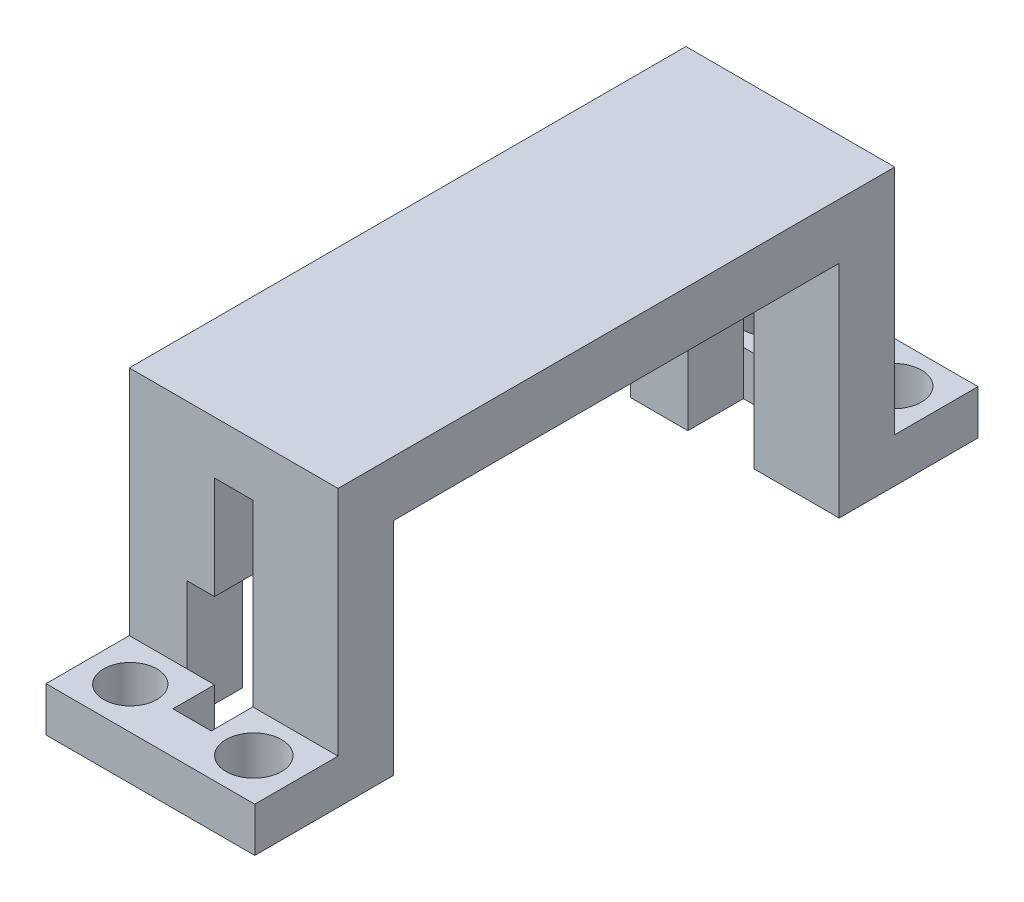
ISO-10303-21;
HEADER;
FILE_DESCRIPTION(('STEP AP214'),'2;1');
FILE_NAME('part.step','',(''),(''),'','','');
FILE_SCHEMA(('AUTOMOTIVE_DESIGN { 1 0 10303 214 1 1 1 1 }'));
ENDSEC;
DATA;
#1=APPLICATION_CONTEXT('core data for automotive mechanical design processes');
#2=APPLICATION_PROTOCOL_DEFINITION('international standard','automotive_design',2000,#1);
#3=PRODUCT_CONTEXT('',#1,'mechanical');
#4=PRODUCT('Part','Part','',(#3));
#5=PRODUCT_RELATED_PRODUCT_CATEGORY('part','',(#4));
#6=PRODUCT_DEFINITION_FORMATION('','',#4);
#7=PRODUCT_DEFINITION_CONTEXT('part definition',#1,'design');
#8=PRODUCT_DEFINITION('design','',#6,#7);
#9=PRODUCT_DEFINITION_SHAPE('','',#8);
#10=(LENGTH_UNIT() NAMED_UNIT(*) SI_UNIT(.MILLI.,.METRE.));
#11=(NAMED_UNIT(*) PLANE_ANGLE_UNIT() SI_UNIT($,.RADIAN.));
#12=(NAMED_UNIT(*) SI_UNIT($,.STERADIAN.) SOLID_ANGLE_UNIT());
#13=UNCERTAINTY_MEASURE_WITH_UNIT(LENGTH_MEASURE(1.E-05),#10,'distance_accuracy_value','');
#14=(GEOMETRIC_REPRESENTATION_CONTEXT(3) GLOBAL_UNCERTAINTY_ASSIGNED_CONTEXT((#13)) GLOBAL_UNIT_ASSIGNED_CONTEXT((#10,
#11,#12)) REPRESENTATION_CONTEXT('',''));
#15=CARTESIAN_POINT('',(0.,0.,0.));
#16=DIRECTION('',(0.,0.,1.));
#17=DIRECTION('',(1.,0.,0.));
#18=AXIS2_PLACEMENT_3D('',#15,#16,#17);
#19=CARTESIAN_POINT('',(7.675,-24.875,-32.5625));
#20=DIRECTION('',(-1.,0.,0.));
#21=DIRECTION('',(0.,0.,1.));
#22=AXIS2_PLACEMENT_3D('',#19,#20,#21);
#23=PLANE('',#22);
#24=DIRECTION('',(0.,0.,-1.));
#25=VECTOR('',#24,1.);
#26=CARTESIAN_POINT('',(7.675,-14.,-20.0625));
#27=LINE('',#26,#25);
#28=CARTESIAN_POINT('',(7.675,-14.,-20.0625));
#29=VERTEX_POINT('',#28);
#30=CARTESIAN_POINT('',(7.675,-14.,-25.0625));
#31=VERTEX_POINT('',#30);
#32=EDGE_CURVE('E270',#29,#31,#27,.T.);
#33=ORIENTED_EDGE('',*,*,#32,.T.);
#34=DIRECTION('',(0.,-1.,0.));
#35=VECTOR('',#34,1.);
#36=CARTESIAN_POINT('',(7.675,-20.875,-25.0625));
#37=LINE('',#36,#35);
#38=CARTESIAN_POINT('',(7.675,-4.75000000000001,-25.0625));
#39=VERTEX_POINT('',#38);
#40=EDGE_CURVE('E401',#39,#31,#37,.T.);
#41=ORIENTED_EDGE('',*,*,#40,.F.);
#42=DIRECTION('',(0.,0.,1.));
#43=VECTOR('',#42,1.);
#44=CARTESIAN_POINT('',(7.675,-4.75000000000001,-32.5625));
#45=LINE('',#44,#43);
#46=CARTESIAN_POINT('',(7.675,-4.75000000000001,25.0625));
#47=VERTEX_POINT('',#46);
#48=EDGE_CURVE('E367',#39,#47,#45,.T.);
#49=ORIENTED_EDGE('',*,*,#48,.T.);
#50=DIRECTION('',(0.,1.,0.));
#51=VECTOR('',#50,1.);
#52=CARTESIAN_POINT('',(7.675,0.,25.0625));
#53=LINE('',#52,#51);
#54=CARTESIAN_POINT('',(7.675,-14.,25.0625));
#55=VERTEX_POINT('',#54);
#56=EDGE_CURVE('E420',#55,#47,#53,.T.);
#57=ORIENTED_EDGE('',*,*,#56,.F.);
#58=DIRECTION('',(0.,0.,1.));
#59=VECTOR('',#58,1.);
#60=CARTESIAN_POINT('',(7.675,-14.,20.0625));
#61=LINE('',#60,#59);
#62=CARTESIAN_POINT('',(7.675,-14.,20.0625));
#63=VERTEX_POINT('',#62);
#64=EDGE_CURVE('E306',#63,#55,#61,.T.);
#65=ORIENTED_EDGE('',*,*,#64,.F.);
#66=DIRECTION('',(0.,-1.,0.));
#67=VECTOR('',#66,1.);
#68=CARTESIAN_POINT('',(7.675,-24.875,20.0625));
#69=LINE('',#68,#67);
#70=CARTESIAN_POINT('',(7.675,-5.,20.0625));
#71=VERTEX_POINT('',#70);
#72=EDGE_CURVE('E412',#71,#63,#69,.T.);
#73=ORIENTED_EDGE('',*,*,#72,.F.);
#74=DIRECTION('',(0.,0.,1.));
#75=VECTOR('',#74,1.);
#76=CARTESIAN_POINT('',(7.675,-5.,20.0625));
#77=LINE('',#76,#75);
#78=CARTESIAN_POINT('',(7.675,-5.,-20.0625));
#79=VERTEX_POINT('',#78);
#80=EDGE_CURVE('E408',#79,#71,#77,.T.);
#81=ORIENTED_EDGE('',*,*,#80,.F.);
#82=DIRECTION('',(0.,1.,0.));
#83=VECTOR('',#82,1.);
#84=CARTESIAN_POINT('',(7.675,-5.,-20.0625));
#85=LINE('',#84,#83);
#86=EDGE_CURVE('E405',#29,#79,#85,.T.);
#87=ORIENTED_EDGE('',*,*,#86,.F.);
#88=EDGE_LOOP('',(#33,#41,#49,#57,#65,#73,#81,#87));
#89=FACE_BOUND('',#88,.T.);
#90=ADVANCED_FACE('F45',(#89),#23,.F.);
#91=DIRECTION('',(0.,-1.,0.));
#92=VECTOR('',#91,1.);
#93=CARTESIAN_POINT('',(7.675,-14.,-25.0625));
#94=LINE('',#93,#92);
#95=CARTESIAN_POINT('',(7.675,-20.875,-25.0625));
#96=VERTEX_POINT('',#95);
#97=CARTESIAN_POINT('',(7.675,-24.875,-25.0625));
#98=VERTEX_POINT('',#97);
#99=EDGE_CURVE('E572',#96,#98,#94,.T.);
#100=ORIENTED_EDGE('',*,*,#99,.T.);
#101=DIRECTION('',(0.,0.,1.));
#102=VECTOR('',#101,1.);
#103=CARTESIAN_POINT('',(7.675,-24.875,-32.5625));
#104=LINE('',#103,#102);
#105=CARTESIAN_POINT('',(7.675,-24.875,-28.8125));
#106=VERTEX_POINT('',#105);
#107=EDGE_CURVE('E277',#106,#98,#104,.T.);
#108=ORIENTED_EDGE('',*,*,#107,.F.);
#109=DIRECTION('',(0.,1.,0.));
#110=VECTOR('',#109,1.);
#111=CARTESIAN_POINT('',(7.675,-20.875,-28.8125));
#112=LINE('',#111,#110);
#113=CARTESIAN_POINT('',(7.675,-20.875,-28.8125));
#114=VERTEX_POINT('',#113);
#115=EDGE_CURVE('E322',#106,#114,#112,.T.);
#116=ORIENTED_EDGE('',*,*,#115,.T.);
#117=DIRECTION('',(0.,0.,-1.));
#118=VECTOR('',#117,1.);
#119=CARTESIAN_POINT('',(7.675,-20.875,-25.0625));
#120=LINE('',#119,#118);
#121=EDGE_CURVE('E54',#96,#114,#120,.T.);
#122=ORIENTED_EDGE('',*,*,#121,.F.);
#123=EDGE_LOOP('',(#100,#108,#116,#122));
#124=FACE_BOUND('',#123,.T.);
#125=ADVANCED_FACE('F571',(#124),#23,.F.);
#126=CARTESIAN_POINT('',(18.8,-5.,-20.0625));
#127=DIRECTION('',(0.,0.,-1.));
#128=DIRECTION('',(0.,1.,0.));
#129=AXIS2_PLACEMENT_3D('',#126,#127,#128);
#130=PLANE('',#129);
#131=DIRECTION('',(1.,0.,0.));
#132=VECTOR('',#131,1.);
#133=CARTESIAN_POINT('',(5.175,-14.,-20.0625));
#134=LINE('',#133,#132);
#135=CARTESIAN_POINT('',(5.175,-14.,-20.0625));
#136=VERTEX_POINT('',#135);
#137=EDGE_CURVE('E283',#136,#29,#134,.T.);
#138=ORIENTED_EDGE('',*,*,#137,.T.);
#139=ORIENTED_EDGE('',*,*,#86,.T.);
#140=DIRECTION('',(-1.,0.,0.));
#141=VECTOR('',#140,1.);
#142=CARTESIAN_POINT('',(18.8,-5.,-20.0625));
#143=LINE('',#142,#141);
#144=CARTESIAN_POINT('',(0.,-5.,-20.0625));
#145=VERTEX_POINT('',#144);
#146=EDGE_CURVE('E527',#79,#145,#143,.T.);
#147=ORIENTED_EDGE('',*,*,#146,.T.);
#148=DIRECTION('',(0.,-1.,0.));
#149=VECTOR('',#148,1.);
#150=CARTESIAN_POINT('',(0.,-5.,-20.0625));
#151=LINE('',#150,#149);
#152=CARTESIAN_POINT('',(0.,-24.875,-20.0625));
#153=VERTEX_POINT('',#152);
#154=EDGE_CURVE('E497',#145,#153,#151,.T.);
#155=ORIENTED_EDGE('',*,*,#154,.T.);
#156=DIRECTION('',(-1.,0.,0.));
#157=VECTOR('',#156,1.);
#158=CARTESIAN_POINT('',(18.8,-24.875,-20.0625));
#159=LINE('',#158,#157);
#160=CARTESIAN_POINT('',(5.175,-24.875,-20.0625));
#161=VERTEX_POINT('',#160);
#162=EDGE_CURVE('E522',#161,#153,#159,.T.);
#163=ORIENTED_EDGE('',*,*,#162,.F.);
#164=DIRECTION('',(0.,1.,0.));
#165=VECTOR('',#164,1.);
#166=CARTESIAN_POINT('',(5.175,-15.75,-20.0625));
#167=LINE('',#166,#165);
#168=EDGE_CURVE('E266',#161,#136,#167,.T.);
#169=ORIENTED_EDGE('',*,*,#168,.T.);
#170=EDGE_LOOP('',(#138,#139,#147,#155,#163,#169));
#171=FACE_BOUND('',#170,.T.);
#172=ADVANCED_FACE('F685',(#171),#130,.F.);
#173=CARTESIAN_POINT('',(18.8,-20.875,-25.0625));
#174=DIRECTION('',(0.,0.,1.));
#175=DIRECTION('',(0.,-1.,0.));
#176=AXIS2_PLACEMENT_3D('',#173,#174,#175);
#177=PLANE('',#176);
#178=DIRECTION('',(1.,0.,0.));
#179=VECTOR('',#178,1.);
#180=CARTESIAN_POINT('',(5.175,-14.,-25.0625));
#181=LINE('',#180,#179);
#182=CARTESIAN_POINT('',(5.175,-14.,-25.0625));
#183=VERTEX_POINT('',#182);
#184=EDGE_CURVE('E279',#183,#31,#181,.T.);
#185=ORIENTED_EDGE('',*,*,#184,.F.);
#186=DIRECTION('',(0.,-1.,0.));
#187=VECTOR('',#186,1.);
#188=CARTESIAN_POINT('',(5.175,-15.75,-25.0625));
#189=LINE('',#188,#187);
#190=CARTESIAN_POINT('',(5.175,-20.875,-25.0625));
#191=VERTEX_POINT('',#190);
#192=EDGE_CURVE('E259',#183,#191,#189,.T.);
#193=ORIENTED_EDGE('',*,*,#192,.T.);
#194=DIRECTION('',(-1.,0.,0.));
#195=VECTOR('',#194,1.);
#196=CARTESIAN_POINT('',(18.8,-20.875,-25.0625));
#197=LINE('',#196,#195);
#198=CARTESIAN_POINT('',(0.,-20.875,-25.0625));
#199=VERTEX_POINT('',#198);
#200=EDGE_CURVE('E466',#191,#199,#197,.T.);
#201=ORIENTED_EDGE('',*,*,#200,.T.);
#202=DIRECTION('',(0.,1.,0.));
#203=VECTOR('',#202,1.);
#204=CARTESIAN_POINT('',(0.,-20.875,-25.0625));
#205=LINE('',#204,#203);
#206=CARTESIAN_POINT('',(0.,0.,-25.0625));
#207=VERTEX_POINT('',#206);
#208=EDGE_CURVE('E427',#199,#207,#205,.T.);
#209=ORIENTED_EDGE('',*,*,#208,.T.);
#210=DIRECTION('',(-1.,0.,0.));
#211=VECTOR('',#210,1.);
#212=CARTESIAN_POINT('',(18.8,0.,-25.0625));
#213=LINE('',#212,#211);
#214=CARTESIAN_POINT('',(18.8,0.,-25.0625));
#215=VERTEX_POINT('',#214);
#216=EDGE_CURVE('E558',#215,#207,#213,.T.);
#217=ORIENTED_EDGE('',*,*,#216,.F.);
#218=DIRECTION('',(0.,1.,0.));
#219=VECTOR('',#218,1.);
#220=CARTESIAN_POINT('',(18.8,-20.875,-25.0625));
#221=LINE('',#220,#219);
#222=CARTESIAN_POINT('',(18.8,-20.875,-25.0625));
#223=VERTEX_POINT('',#222);
#224=EDGE_CURVE('E428',#223,#215,#221,.T.);
#225=ORIENTED_EDGE('',*,*,#224,.F.);
#226=CARTESIAN_POINT('',(11.125,-20.875,-25.0625));
#227=VERTEX_POINT('',#226);
#228=EDGE_CURVE('E512',#223,#227,#197,.T.);
#229=ORIENTED_EDGE('',*,*,#228,.T.);
#230=DIRECTION('',(0.,1.,0.));
#231=VECTOR('',#230,1.);
#232=CARTESIAN_POINT('',(11.125,-20.875,-25.0625));
#233=LINE('',#232,#231);
#234=CARTESIAN_POINT('',(11.125,-4.75000000000001,-25.0625));
#235=VERTEX_POINT('',#234);
#236=EDGE_CURVE('E365',#227,#235,#233,.T.);
#237=ORIENTED_EDGE('',*,*,#236,.T.);
#238=DIRECTION('',(-1.,0.,0.));
#239=VECTOR('',#238,1.);
#240=CARTESIAN_POINT('',(18.8,-4.75000000000001,-25.0625));
#241=LINE('',#240,#239);
#242=EDGE_CURVE('E423',#235,#39,#241,.T.);
#243=ORIENTED_EDGE('',*,*,#242,.T.);
#244=ORIENTED_EDGE('',*,*,#40,.T.);
#245=EDGE_LOOP('',(#185,#193,#201,#209,#217,#225,#229,#237,#243,#244));
#246=FACE_BOUND('',#245,.T.);
#247=ADVANCED_FACE('F47',(#246),#177,.F.);
#248=CARTESIAN_POINT('',(18.8,-24.875,-25.0625));
#249=DIRECTION('',(0.,1.,0.));
#250=DIRECTION('',(0.,0.,1.));
#251=AXIS2_PLACEMENT_3D('',#248,#249,#250);
#252=PLANE('',#251);
#253=CARTESIAN_POINT('',(14.9625,-24.875,-28.8125));
#254=DIRECTION('',(0.,1.,0.));
#255=DIRECTION('',(0.,0.,1.));
#256=AXIS2_PLACEMENT_3D('',#253,#254,#255);
#257=CIRCLE('',#256,2.5);
#258=CARTESIAN_POINT('',(14.9625,-24.875,-26.3125));
#259=VERTEX_POINT('',#258);
#260=EDGE_CURVE('E637',#259,#259,#257,.T.);
#261=ORIENTED_EDGE('',*,*,#260,.T.);
#262=EDGE_LOOP('',(#261));
#263=FACE_BOUND('',#262,.T.);
#264=DIRECTION('',(0.,0.,1.));
#265=VECTOR('',#264,1.);
#266=CARTESIAN_POINT('',(11.125,-24.875,-32.5625));
#267=LINE('',#266,#265);
#268=CARTESIAN_POINT('',(11.125,-24.875,-28.8125));
#269=VERTEX_POINT('',#268);
#270=CARTESIAN_POINT('',(11.125,-24.875,-20.0625));
#271=VERTEX_POINT('',#270);
#272=EDGE_CURVE('E375',#269,#271,#267,.T.);
#273=ORIENTED_EDGE('',*,*,#272,.F.);
#274=DIRECTION('',(-1.,0.,0.));
#275=VECTOR('',#274,1.);
#276=CARTESIAN_POINT('',(18.802,-24.875,-28.8125));
#277=LINE('',#276,#275);
#278=EDGE_CURVE('E327',#269,#106,#277,.T.);
#279=ORIENTED_EDGE('',*,*,#278,.T.);
#280=ORIENTED_EDGE('',*,*,#107,.T.);
#281=DIRECTION('',(1.,0.,0.));
#282=VECTOR('',#281,1.);
#283=CARTESIAN_POINT('',(5.175,-24.875,-25.0625));
#284=LINE('',#283,#282);
#285=CARTESIAN_POINT('',(5.175,-24.875,-25.0625));
#286=VERTEX_POINT('',#285);
#287=EDGE_CURVE('E252',#286,#98,#284,.T.);
#288=ORIENTED_EDGE('',*,*,#287,.F.);
#289=DIRECTION('',(0.,0.,1.));
#290=VECTOR('',#289,1.);
#291=CARTESIAN_POINT('',(5.175,-24.875,-25.0625));
#292=LINE('',#291,#290);
#293=EDGE_CURVE('E260',#286,#161,#292,.T.);
#294=ORIENTED_EDGE('',*,*,#293,.T.);
#295=ORIENTED_EDGE('',*,*,#162,.T.);
#296=DIRECTION('',(0.,0.,-1.));
#297=VECTOR('',#296,1.);
#298=CARTESIAN_POINT('',(0.,-24.875,-25.0625));
#299=LINE('',#298,#297);
#300=CARTESIAN_POINT('',(0.,-24.875,-32.5625));
#301=VERTEX_POINT('',#300);
#302=EDGE_CURVE('E501',#153,#301,#299,.T.);
#303=ORIENTED_EDGE('',*,*,#302,.T.);
#304=DIRECTION('',(-1.,0.,0.));
#305=VECTOR('',#304,1.);
#306=CARTESIAN_POINT('',(18.8,-24.875,-32.5625));
#307=LINE('',#306,#305);
#308=CARTESIAN_POINT('',(18.8,-24.875,-32.5625));
#309=VERTEX_POINT('',#308);
#310=EDGE_CURVE('E519',#309,#301,#307,.T.);
#311=ORIENTED_EDGE('',*,*,#310,.F.);
#312=DIRECTION('',(0.,0.,-1.));
#313=VECTOR('',#312,1.);
#314=CARTESIAN_POINT('',(18.8,-24.875,-20.0625));
#315=LINE('',#314,#313);
#316=CARTESIAN_POINT('',(18.8,-24.875,-20.0625));
#317=VERTEX_POINT('',#316);
#318=EDGE_CURVE('E457',#317,#309,#315,.T.);
#319=ORIENTED_EDGE('',*,*,#318,.F.);
#320=EDGE_CURVE('E523',#317,#271,#159,.T.);
#321=ORIENTED_EDGE('',*,*,#320,.T.);
#322=EDGE_LOOP('',(#273,#279,#280,#288,#294,#295,#303,#311,#319,#321));
#323=FACE_BOUND('',#322,.T.);
#324=CARTESIAN_POINT('',(3.83750000000001,-24.875,-28.8125));
#325=DIRECTION('',(0.,1.,0.));
#326=DIRECTION('',(0.,0.,1.));
#327=AXIS2_PLACEMENT_3D('',#324,#325,#326);
#328=CIRCLE('',#327,2.4);
#329=CARTESIAN_POINT('',(3.83750000000001,-24.875,-26.4125));
#330=VERTEX_POINT('',#329);
#331=EDGE_CURVE('E335',#330,#330,#328,.F.);
#332=ORIENTED_EDGE('',*,*,#331,.F.);
#333=EDGE_LOOP('',(#332));
#334=FACE_BOUND('',#333,.T.);
#335=ADVANCED_FACE('F274',(#263,#323,#334),#252,.F.);
#336=CARTESIAN_POINT('',(7.675,-24.875,25.0625));
#337=VERTEX_POINT('',#336);
#338=CARTESIAN_POINT('',(7.675,-24.875,28.8125));
#339=VERTEX_POINT('',#338);
#340=EDGE_CURVE('E366',#337,#339,#104,.T.);
#341=ORIENTED_EDGE('',*,*,#340,.F.);
#342=DIRECTION('',(0.,-1.,0.));
#343=VECTOR('',#342,1.);
#344=CARTESIAN_POINT('',(7.675,-15.75,25.0625));
#345=LINE('',#344,#343);
#346=CARTESIAN_POINT('',(7.675,-20.875,25.0625));
#347=VERTEX_POINT('',#346);
#348=EDGE_CURVE('E293',#347,#337,#345,.T.);
#349=ORIENTED_EDGE('',*,*,#348,.F.);
#350=DIRECTION('',(0.,0.,-1.));
#351=VECTOR('',#350,1.);
#352=CARTESIAN_POINT('',(7.675,-20.875,25.0625));
#353=LINE('',#352,#351);
#354=CARTESIAN_POINT('',(7.675,-20.875,28.8125));
#355=VERTEX_POINT('',#354);
#356=EDGE_CURVE('E416',#355,#347,#353,.T.);
#357=ORIENTED_EDGE('',*,*,#356,.F.);
#358=DIRECTION('',(0.,1.,0.));
#359=VECTOR('',#358,1.);
#360=CARTESIAN_POINT('',(7.675,-20.875,28.8125));
#361=LINE('',#360,#359);
#362=EDGE_CURVE('E332',#339,#355,#361,.T.);
#363=ORIENTED_EDGE('',*,*,#362,.F.);
#364=EDGE_LOOP('',(#341,#349,#357,#363));
#365=FACE_BOUND('',#364,.T.);
#366=ADVANCED_FACE('F620',(#365),#23,.F.);
#367=CARTESIAN_POINT('',(11.125,-4.75000000000001,-32.5625));
#368=DIRECTION('',(1.,0.,0.));
#369=DIRECTION('',(0.,1.,0.));
#370=AXIS2_PLACEMENT_3D('',#367,#368,#369);
#371=PLANE('',#370);
#372=DIRECTION('',(0.,0.,1.));
#373=VECTOR('',#372,1.);
#374=CARTESIAN_POINT('',(11.125,-20.875,-25.0625));
#375=LINE('',#374,#373);
#376=CARTESIAN_POINT('',(11.125,-20.875,-28.8125));
#377=VERTEX_POINT('',#376);
#378=EDGE_CURVE('E562',#377,#227,#375,.T.);
#379=ORIENTED_EDGE('',*,*,#378,.F.);
#380=DIRECTION('',(0.,1.,0.));
#381=VECTOR('',#380,1.);
#382=CARTESIAN_POINT('',(11.125,-20.875,-28.8125));
#383=LINE('',#382,#381);
#384=EDGE_CURVE('E313',#269,#377,#383,.T.);
#385=ORIENTED_EDGE('',*,*,#384,.F.);
#386=ORIENTED_EDGE('',*,*,#272,.T.);
#387=DIRECTION('',(0.,-1.,0.));
#388=VECTOR('',#387,1.);
#389=CARTESIAN_POINT('',(11.125,-5.,-20.0625));
#390=LINE('',#389,#388);
#391=CARTESIAN_POINT('',(11.125,-5.,-20.0625));
#392=VERTEX_POINT('',#391);
#393=EDGE_CURVE('E381',#392,#271,#390,.T.);
#394=ORIENTED_EDGE('',*,*,#393,.F.);
#395=DIRECTION('',(0.,0.,-1.));
#396=VECTOR('',#395,1.);
#397=CARTESIAN_POINT('',(11.125,-5.,20.0625));
#398=LINE('',#397,#396);
#399=CARTESIAN_POINT('',(11.125,-5.,20.0625));
#400=VERTEX_POINT('',#399);
#401=EDGE_CURVE('E385',#400,#392,#398,.T.);
#402=ORIENTED_EDGE('',*,*,#401,.F.);
#403=DIRECTION('',(0.,1.,0.));
#404=VECTOR('',#403,1.);
#405=CARTESIAN_POINT('',(11.125,-24.875,20.0625));
#406=LINE('',#405,#404);
#407=CARTESIAN_POINT('',(11.125,-24.875,20.0625));
#408=VERTEX_POINT('',#407);
#409=EDGE_CURVE('E389',#408,#400,#406,.T.);
#410=ORIENTED_EDGE('',*,*,#409,.F.);
#411=CARTESIAN_POINT('',(11.125,-24.875,28.8125));
#412=VERTEX_POINT('',#411);
#413=EDGE_CURVE('E362',#408,#412,#267,.T.);
#414=ORIENTED_EDGE('',*,*,#413,.T.);
#415=DIRECTION('',(0.,1.,0.));
#416=VECTOR('',#415,1.);
#417=CARTESIAN_POINT('',(11.125,-20.875,28.8125));
#418=LINE('',#417,#416);
#419=CARTESIAN_POINT('',(11.125,-20.875,28.8125));
#420=VERTEX_POINT('',#419);
#421=EDGE_CURVE('E326',#412,#420,#418,.T.);
#422=ORIENTED_EDGE('',*,*,#421,.T.);
#423=DIRECTION('',(0.,0.,1.));
#424=VECTOR('',#423,1.);
#425=CARTESIAN_POINT('',(11.125,-20.875,25.0625));
#426=LINE('',#425,#424);
#427=CARTESIAN_POINT('',(11.125,-20.875,25.0625));
#428=VERTEX_POINT('',#427);
#429=EDGE_CURVE('E393',#428,#420,#426,.T.);
#430=ORIENTED_EDGE('',*,*,#429,.F.);
#431=DIRECTION('',(0.,-1.,0.));
#432=VECTOR('',#431,1.);
#433=CARTESIAN_POINT('',(11.125,0.,25.0625));
#434=LINE('',#433,#432);
#435=CARTESIAN_POINT('',(11.125,-4.75000000000001,25.0625));
#436=VERTEX_POINT('',#435);
#437=EDGE_CURVE('E397',#436,#428,#434,.T.);
#438=ORIENTED_EDGE('',*,*,#437,.F.);
#439=DIRECTION('',(0.,0.,1.));
#440=VECTOR('',#439,1.);
#441=CARTESIAN_POINT('',(11.125,-4.75000000000001,-32.5625));
#442=LINE('',#441,#440);
#443=EDGE_CURVE('E371',#235,#436,#442,.T.);
#444=ORIENTED_EDGE('',*,*,#443,.F.);
#445=ORIENTED_EDGE('',*,*,#236,.F.);
#446=EDGE_LOOP('',(#379,#385,#386,#394,#402,#410,#414,#422,#430,#438,#444,#445));
#447=FACE_BOUND('',#446,.T.);
#448=ADVANCED_FACE('F580',(#447),#371,.F.);
#449=CARTESIAN_POINT('',(18.8,-24.875,20.0625));
#450=DIRECTION('',(0.,0.,1.));
#451=DIRECTION('',(0.,-1.,0.));
#452=AXIS2_PLACEMENT_3D('',#449,#450,#451);
#453=PLANE('',#452);
#454=ORIENTED_EDGE('',*,*,#72,.T.);
#455=DIRECTION('',(1.,0.,0.));
#456=VECTOR('',#455,1.);
#457=CARTESIAN_POINT('',(5.175,-14.,20.0625));
#458=LINE('',#457,#456);
#459=CARTESIAN_POINT('',(5.175,-14.,20.0625));
#460=VERTEX_POINT('',#459);
#461=EDGE_CURVE('E305',#460,#63,#458,.T.);
#462=ORIENTED_EDGE('',*,*,#461,.F.);
#463=DIRECTION('',(0.,1.,0.));
#464=VECTOR('',#463,1.);
#465=CARTESIAN_POINT('',(5.175,-24.875,20.0625));
#466=LINE('',#465,#464);
#467=CARTESIAN_POINT('',(5.175,-24.875,20.0625));
#468=VERTEX_POINT('',#467);
#469=EDGE_CURVE('E292',#468,#460,#466,.T.);
#470=ORIENTED_EDGE('',*,*,#469,.F.);
#471=DIRECTION('',(-1.,0.,0.));
#472=VECTOR('',#471,1.);
#473=CARTESIAN_POINT('',(18.8,-24.875,20.0625));
#474=LINE('',#473,#472);
#475=CARTESIAN_POINT('',(0.,-24.875,20.0625));
#476=VERTEX_POINT('',#475);
#477=EDGE_CURVE('E537',#468,#476,#474,.T.);
#478=ORIENTED_EDGE('',*,*,#477,.T.);
#479=DIRECTION('',(0.,1.,0.));
#480=VECTOR('',#479,1.);
#481=CARTESIAN_POINT('',(0.,-24.875,20.0625));
#482=LINE('',#481,#480);
#483=CARTESIAN_POINT('',(0.,-5.,20.0625));
#484=VERTEX_POINT('',#483);
#485=EDGE_CURVE('E489',#476,#484,#482,.T.);
#486=ORIENTED_EDGE('',*,*,#485,.T.);
#487=DIRECTION('',(-1.,0.,0.));
#488=VECTOR('',#487,1.);
#489=CARTESIAN_POINT('',(18.8,-5.,20.0625));
#490=LINE('',#489,#488);
#491=EDGE_CURVE('E532',#71,#484,#490,.T.);
#492=ORIENTED_EDGE('',*,*,#491,.F.);
#493=EDGE_LOOP('',(#454,#462,#470,#478,#486,#492));
#494=FACE_BOUND('',#493,.T.);
#495=ADVANCED_FACE('F694',(#494),#453,.F.);
#496=CARTESIAN_POINT('',(18.8,-5.,20.0625));
#497=DIRECTION('',(0.,1.,0.));
#498=DIRECTION('',(0.,0.,1.));
#499=AXIS2_PLACEMENT_3D('',#496,#497,#498);
#500=PLANE('',#499);
#501=ORIENTED_EDGE('',*,*,#146,.F.);
#502=ORIENTED_EDGE('',*,*,#80,.T.);
#503=ORIENTED_EDGE('',*,*,#491,.T.);
#504=DIRECTION('',(0.,0.,-1.));
#505=VECTOR('',#504,1.);
#506=CARTESIAN_POINT('',(0.,-5.,20.0625));
#507=LINE('',#506,#505);
#508=EDGE_CURVE('E493',#484,#145,#507,.T.);
#509=ORIENTED_EDGE('',*,*,#508,.T.);
#510=EDGE_LOOP('',(#501,#502,#503,#509));
#511=FACE_BOUND('',#510,.T.);
#512=ADVANCED_FACE('F712',(#511),#500,.F.);
#513=CARTESIAN_POINT('',(18.8,0.,25.0625));
#514=DIRECTION('',(0.,-1.,0.));
#515=DIRECTION('',(0.,0.,-1.));
#516=AXIS2_PLACEMENT_3D('',#513,#514,#515);
#517=PLANE('',#516);
#518=DIRECTION('',(0.,0.,1.));
#519=VECTOR('',#518,1.);
#520=CARTESIAN_POINT('',(0.,0.,25.0625));
#521=LINE('',#520,#519);
#522=CARTESIAN_POINT('',(0.,0.,25.0625));
#523=VERTEX_POINT('',#522);
#524=EDGE_CURVE('E470',#207,#523,#521,.T.);
#525=ORIENTED_EDGE('',*,*,#524,.T.);
#526=DIRECTION('',(-1.,0.,0.));
#527=VECTOR('',#526,1.);
#528=CARTESIAN_POINT('',(18.8,0.,25.0625));
#529=LINE('',#528,#527);
#530=CARTESIAN_POINT('',(18.8,0.,25.0625));
#531=VERTEX_POINT('',#530);
#532=EDGE_CURVE('E553',#531,#523,#529,.T.);
#533=ORIENTED_EDGE('',*,*,#532,.F.);
#534=DIRECTION('',(0.,0.,1.));
#535=VECTOR('',#534,1.);
#536=CARTESIAN_POINT('',(18.8,0.,25.0625));
#537=LINE('',#536,#535);
#538=EDGE_CURVE('E432',#215,#531,#537,.T.);
#539=ORIENTED_EDGE('',*,*,#538,.F.);
#540=ORIENTED_EDGE('',*,*,#216,.T.);
#541=EDGE_LOOP('',(#525,#533,#539,#540));
#542=FACE_BOUND('',#541,.T.);
#543=ADVANCED_FACE('F727',(#542),#517,.F.);
#544=CARTESIAN_POINT('',(18.8,0.,25.0625));
#545=DIRECTION('',(0.,0.,-1.));
#546=DIRECTION('',(0.,1.,0.));
#547=AXIS2_PLACEMENT_3D('',#544,#545,#546);
#548=PLANE('',#547);
#549=DIRECTION('',(0.,-1.,0.));
#550=VECTOR('',#549,1.);
#551=CARTESIAN_POINT('',(5.175,-14.,25.0625));
#552=LINE('',#551,#550);
#553=CARTESIAN_POINT('',(5.175,-14.,25.0625));
#554=VERTEX_POINT('',#553);
#555=CARTESIAN_POINT('',(5.175,-20.875,25.0625));
#556=VERTEX_POINT('',#555);
#557=EDGE_CURVE('E301',#554,#556,#552,.T.);
#558=ORIENTED_EDGE('',*,*,#557,.F.);
#559=DIRECTION('',(1.,0.,0.));
#560=VECTOR('',#559,1.);
#561=CARTESIAN_POINT('',(5.175,-14.,25.0625));
#562=LINE('',#561,#560);
#563=EDGE_CURVE('E314',#554,#55,#562,.T.);
#564=ORIENTED_EDGE('',*,*,#563,.T.);
#565=ORIENTED_EDGE('',*,*,#56,.T.);
#566=DIRECTION('',(1.,0.,0.));
#567=VECTOR('',#566,1.);
#568=CARTESIAN_POINT('',(18.8,-4.75000000000001,25.0625));
#569=LINE('',#568,#567);
#570=EDGE_CURVE('E11',#47,#436,#569,.T.);
#571=ORIENTED_EDGE('',*,*,#570,.T.);
#572=ORIENTED_EDGE('',*,*,#437,.T.);
#573=DIRECTION('',(-1.,0.,0.));
#574=VECTOR('',#573,1.);
#575=CARTESIAN_POINT('',(18.8,-20.875,25.0625));
#576=LINE('',#575,#574);
#577=CARTESIAN_POINT('',(18.8,-20.875,25.0625));
#578=VERTEX_POINT('',#577);
#579=EDGE_CURVE('E549',#578,#428,#576,.T.);
#580=ORIENTED_EDGE('',*,*,#579,.F.);
#581=DIRECTION('',(0.,-1.,0.));
#582=VECTOR('',#581,1.);
#583=CARTESIAN_POINT('',(18.8,0.,25.0625));
#584=LINE('',#583,#582);
#585=EDGE_CURVE('E436',#531,#578,#584,.T.);
#586=ORIENTED_EDGE('',*,*,#585,.F.);
#587=ORIENTED_EDGE('',*,*,#532,.T.);
#588=DIRECTION('',(0.,-1.,0.));
#589=VECTOR('',#588,1.);
#590=CARTESIAN_POINT('',(0.,0.,25.0625));
#591=LINE('',#590,#589);
#592=CARTESIAN_POINT('',(0.,-20.875,25.0625));
#593=VERTEX_POINT('',#592);
#594=EDGE_CURVE('E473',#523,#593,#591,.T.);
#595=ORIENTED_EDGE('',*,*,#594,.T.);
#596=EDGE_CURVE('E548',#556,#593,#576,.T.);
#597=ORIENTED_EDGE('',*,*,#596,.F.);
#598=EDGE_LOOP('',(#558,#564,#565,#571,#572,#580,#586,#587,#595,#597));
#599=FACE_BOUND('',#598,.T.);
#600=ADVANCED_FACE('F724',(#599),#548,.F.);
#601=CARTESIAN_POINT('',(18.8,-20.875,25.0625));
#602=DIRECTION('',(0.,-1.,0.));
#603=DIRECTION('',(0.,0.,-1.));
#604=AXIS2_PLACEMENT_3D('',#601,#602,#603);
#605=PLANE('',#604);
#606=CARTESIAN_POINT('',(14.9625,-20.875,28.8125));
#607=DIRECTION('',(0.,1.,0.));
#608=DIRECTION('',(0.,0.,1.));
#609=AXIS2_PLACEMENT_3D('',#606,#607,#608);
#610=CIRCLE('',#609,2.5);
#611=CARTESIAN_POINT('',(14.9625,-20.875,31.3125));
#612=VERTEX_POINT('',#611);
#613=EDGE_CURVE('E647',#612,#612,#610,.T.);
#614=ORIENTED_EDGE('',*,*,#613,.F.);
#615=EDGE_LOOP('',(#614));
#616=FACE_BOUND('',#615,.T.);
#617=DIRECTION('',(-1.,0.,0.));
#618=VECTOR('',#617,1.);
#619=CARTESIAN_POINT('',(18.802,-20.875,28.8125));
#620=LINE('',#619,#618);
#621=EDGE_CURVE('E336',#420,#355,#620,.T.);
#622=ORIENTED_EDGE('',*,*,#621,.T.);
#623=ORIENTED_EDGE('',*,*,#356,.T.);
#624=EDGE_CURVE('E554',#347,#556,#576,.T.);
#625=ORIENTED_EDGE('',*,*,#624,.T.);
#626=ORIENTED_EDGE('',*,*,#596,.T.);
#627=DIRECTION('',(0.,0.,1.));
#628=VECTOR('',#627,1.);
#629=CARTESIAN_POINT('',(0.,-20.875,25.0625));
#630=LINE('',#629,#628);
#631=CARTESIAN_POINT('',(0.,-20.875,32.5625));
#632=VERTEX_POINT('',#631);
#633=EDGE_CURVE('E477',#593,#632,#630,.T.);
#634=ORIENTED_EDGE('',*,*,#633,.T.);
#635=DIRECTION('',(-1.,0.,0.));
#636=VECTOR('',#635,1.);
#637=CARTESIAN_POINT('',(18.8,-20.875,32.5625));
#638=LINE('',#637,#636);
#639=CARTESIAN_POINT('',(18.8,-20.875,32.5625));
#640=VERTEX_POINT('',#639);
#641=EDGE_CURVE('E545',#640,#632,#638,.T.);
#642=ORIENTED_EDGE('',*,*,#641,.F.);
#643=DIRECTION('',(0.,0.,1.));
#644=VECTOR('',#643,1.);
#645=CARTESIAN_POINT('',(18.8,-20.875,25.0625));
#646=LINE('',#645,#644);
#647=EDGE_CURVE('E439',#578,#640,#646,.T.);
#648=ORIENTED_EDGE('',*,*,#647,.F.);
#649=ORIENTED_EDGE('',*,*,#579,.T.);
#650=ORIENTED_EDGE('',*,*,#429,.T.);
#651=EDGE_LOOP('',(#622,#623,#625,#626,#634,#642,#648,#649,#650));
#652=FACE_BOUND('',#651,.T.);
#653=CARTESIAN_POINT('',(3.8375,-20.875,28.8125));
#654=DIRECTION('',(0.,1.,0.));
#655=DIRECTION('',(0.,0.,1.));
#656=AXIS2_PLACEMENT_3D('',#653,#654,#655);
#657=CIRCLE('',#656,2.4);
#658=CARTESIAN_POINT('',(3.8375,-20.875,31.2125));
#659=VERTEX_POINT('',#658);
#660=EDGE_CURVE('E354',#659,#659,#657,.T.);
#661=ORIENTED_EDGE('',*,*,#660,.F.);
#662=EDGE_LOOP('',(#661));
#663=FACE_BOUND('',#662,.T.);
#664=ADVANCED_FACE('F612',(#616,#652,#663),#605,.F.);
#665=CARTESIAN_POINT('',(18.8,-24.875,32.5625));
#666=DIRECTION('',(0.,0.,-1.));
#667=DIRECTION('',(0.,1.,0.));
#668=AXIS2_PLACEMENT_3D('',#665,#666,#667);
#669=PLANE('',#668);
#670=ORIENTED_EDGE('',*,*,#641,.T.);
#671=DIRECTION('',(0.,-1.,0.));
#672=VECTOR('',#671,1.);
#673=CARTESIAN_POINT('',(0.,-24.875,32.5625));
#674=LINE('',#673,#672);
#675=CARTESIAN_POINT('',(0.,-24.875,32.5625));
#676=VERTEX_POINT('',#675);
#677=EDGE_CURVE('E481',#632,#676,#674,.T.);
#678=ORIENTED_EDGE('',*,*,#677,.T.);
#679=DIRECTION('',(-1.,0.,0.));
#680=VECTOR('',#679,1.);
#681=CARTESIAN_POINT('',(18.8,-24.875,32.5625));
#682=LINE('',#681,#680);
#683=CARTESIAN_POINT('',(18.8,-24.875,32.5625));
#684=VERTEX_POINT('',#683);
#685=EDGE_CURVE('E542',#684,#676,#682,.T.);
#686=ORIENTED_EDGE('',*,*,#685,.F.);
#687=DIRECTION('',(0.,-1.,0.));
#688=VECTOR('',#687,1.);
#689=CARTESIAN_POINT('',(18.8,-24.875,32.5625));
#690=LINE('',#689,#688);
#691=EDGE_CURVE('E442',#640,#684,#690,.T.);
#692=ORIENTED_EDGE('',*,*,#691,.F.);
#693=EDGE_LOOP('',(#670,#678,#686,#692));
#694=FACE_BOUND('',#693,.T.);
#695=ADVANCED_FACE('F718',(#694),#669,.F.);
#696=CARTESIAN_POINT('',(18.8,-24.875,25.0625));
#697=DIRECTION('',(0.,1.,0.));
#698=DIRECTION('',(0.,0.,1.));
#699=AXIS2_PLACEMENT_3D('',#696,#697,#698);
#700=PLANE('',#699);
#701=CARTESIAN_POINT('',(14.9625,-24.875,28.8125));
#702=DIRECTION('',(0.,1.,0.));
#703=DIRECTION('',(0.,0.,1.));
#704=AXIS2_PLACEMENT_3D('',#701,#702,#703);
#705=CIRCLE('',#704,2.5);
#706=CARTESIAN_POINT('',(14.9625,-24.875,31.3125));
#707=VERTEX_POINT('',#706);
#708=EDGE_CURVE('E643',#707,#707,#705,.T.);
#709=ORIENTED_EDGE('',*,*,#708,.T.);
#710=EDGE_LOOP('',(#709));
#711=FACE_BOUND('',#710,.T.);
#712=ORIENTED_EDGE('',*,*,#685,.T.);
#713=DIRECTION('',(0.,0.,-1.));
#714=VECTOR('',#713,1.);
#715=CARTESIAN_POINT('',(0.,-24.875,25.0625));
#716=LINE('',#715,#714);
#717=EDGE_CURVE('E485',#676,#476,#716,.T.);
#718=ORIENTED_EDGE('',*,*,#717,.T.);
#719=ORIENTED_EDGE('',*,*,#477,.F.);
#720=DIRECTION('',(0.,0.,-1.));
#721=VECTOR('',#720,1.);
#722=CARTESIAN_POINT('',(5.175,-24.875,25.0625));
#723=LINE('',#722,#721);
#724=CARTESIAN_POINT('',(5.175,-24.875,25.0625));
#725=VERTEX_POINT('',#724);
#726=EDGE_CURVE('E289',#725,#468,#723,.T.);
#727=ORIENTED_EDGE('',*,*,#726,.F.);
#728=DIRECTION('',(1.,0.,0.));
#729=VECTOR('',#728,1.);
#730=CARTESIAN_POINT('',(5.175,-24.875,25.0625));
#731=LINE('',#730,#729);
#732=EDGE_CURVE('E61',#725,#337,#731,.T.);
#733=ORIENTED_EDGE('',*,*,#732,.T.);
#734=ORIENTED_EDGE('',*,*,#340,.T.);
#735=DIRECTION('',(-1.,0.,0.));
#736=VECTOR('',#735,1.);
#737=CARTESIAN_POINT('',(18.802,-24.875,28.8125));
#738=LINE('',#737,#736);
#739=EDGE_CURVE('E340',#412,#339,#738,.T.);
#740=ORIENTED_EDGE('',*,*,#739,.F.);
#741=ORIENTED_EDGE('',*,*,#413,.F.);
#742=CARTESIAN_POINT('',(18.8,-24.875,20.0625));
#743=VERTEX_POINT('',#742);
#744=EDGE_CURVE('E538',#743,#408,#474,.T.);
#745=ORIENTED_EDGE('',*,*,#744,.F.);
#746=DIRECTION('',(0.,0.,-1.));
#747=VECTOR('',#746,1.);
#748=CARTESIAN_POINT('',(18.8,-24.875,25.0625));
#749=LINE('',#748,#747);
#750=EDGE_CURVE('E445',#684,#743,#749,.T.);
#751=ORIENTED_EDGE('',*,*,#750,.F.);
#752=EDGE_LOOP('',(#712,#718,#719,#727,#733,#734,#740,#741,#745,#751));
#753=FACE_BOUND('',#752,.T.);
#754=CARTESIAN_POINT('',(3.8375,-24.875,28.8125));
#755=DIRECTION('',(0.,1.,0.));
#756=DIRECTION('',(0.,0.,1.));
#757=AXIS2_PLACEMENT_3D('',#754,#755,#756);
#758=CIRCLE('',#757,2.4);
#759=CARTESIAN_POINT('',(3.8375,-24.875,31.2125));
#760=VERTEX_POINT('',#759);
#761=EDGE_CURVE('E358',#760,#760,#758,.F.);
#762=ORIENTED_EDGE('',*,*,#761,.F.);
#763=EDGE_LOOP('',(#762));
#764=FACE_BOUND('',#763,.T.);
#765=ADVANCED_FACE('F715',(#711,#753,#764),#700,.F.);
#766=ORIENTED_EDGE('',*,*,#744,.T.);
#767=ORIENTED_EDGE('',*,*,#409,.T.);
#768=CARTESIAN_POINT('',(18.8,-5.,20.0625));
#769=VERTEX_POINT('',#768);
#770=EDGE_CURVE('E533',#769,#400,#490,.T.);
#771=ORIENTED_EDGE('',*,*,#770,.F.);
#772=DIRECTION('',(0.,1.,0.));
#773=VECTOR('',#772,1.);
#774=CARTESIAN_POINT('',(18.8,-24.875,20.0625));
#775=LINE('',#774,#773);
#776=EDGE_CURVE('E448',#743,#769,#775,.T.);
#777=ORIENTED_EDGE('',*,*,#776,.F.);
#778=EDGE_LOOP('',(#766,#767,#771,#777));
#779=FACE_BOUND('',#778,.T.);
#780=ADVANCED_FACE('F710',(#779),#453,.F.);
#781=ORIENTED_EDGE('',*,*,#770,.T.);
#782=ORIENTED_EDGE('',*,*,#401,.T.);
#783=CARTESIAN_POINT('',(18.8,-5.,-20.0625));
#784=VERTEX_POINT('',#783);
#785=EDGE_CURVE('E528',#784,#392,#143,.T.);
#786=ORIENTED_EDGE('',*,*,#785,.F.);
#787=DIRECTION('',(0.,0.,-1.));
#788=VECTOR('',#787,1.);
#789=CARTESIAN_POINT('',(18.8,-5.,20.0625));
#790=LINE('',#789,#788);
#791=EDGE_CURVE('E451',#769,#784,#790,.T.);
#792=ORIENTED_EDGE('',*,*,#791,.F.);
#793=EDGE_LOOP('',(#781,#782,#786,#792));
#794=FACE_BOUND('',#793,.T.);
#795=ADVANCED_FACE('F706',(#794),#500,.F.);
#796=ORIENTED_EDGE('',*,*,#785,.T.);
#797=ORIENTED_EDGE('',*,*,#393,.T.);
#798=ORIENTED_EDGE('',*,*,#320,.F.);
#799=DIRECTION('',(0.,-1.,0.));
#800=VECTOR('',#799,1.);
#801=CARTESIAN_POINT('',(18.8,-5.,-20.0625));
#802=LINE('',#801,#800);
#803=EDGE_CURVE('E454',#784,#317,#802,.T.);
#804=ORIENTED_EDGE('',*,*,#803,.F.);
#805=EDGE_LOOP('',(#796,#797,#798,#804));
#806=FACE_BOUND('',#805,.T.);
#807=ADVANCED_FACE('F675',(#806),#130,.F.);
#808=CARTESIAN_POINT('',(18.8,-24.875,-32.5625));
#809=DIRECTION('',(0.,0.,1.));
#810=DIRECTION('',(0.,-1.,0.));
#811=AXIS2_PLACEMENT_3D('',#808,#809,#810);
#812=PLANE('',#811);
#813=ORIENTED_EDGE('',*,*,#310,.T.);
#814=DIRECTION('',(0.,1.,0.));
#815=VECTOR('',#814,1.);
#816=CARTESIAN_POINT('',(0.,-24.875,-32.5625));
#817=LINE('',#816,#815);
#818=CARTESIAN_POINT('',(0.,-20.875,-32.5625));
#819=VERTEX_POINT('',#818);
#820=EDGE_CURVE('E505',#301,#819,#817,.T.);
#821=ORIENTED_EDGE('',*,*,#820,.T.);
#822=DIRECTION('',(-1.,0.,0.));
#823=VECTOR('',#822,1.);
#824=CARTESIAN_POINT('',(18.8,-20.875,-32.5625));
#825=LINE('',#824,#823);
#826=CARTESIAN_POINT('',(18.8,-20.875,-32.5625));
#827=VERTEX_POINT('',#826);
#828=EDGE_CURVE('E516',#827,#819,#825,.T.);
#829=ORIENTED_EDGE('',*,*,#828,.F.);
#830=DIRECTION('',(0.,1.,0.));
#831=VECTOR('',#830,1.);
#832=CARTESIAN_POINT('',(18.8,-24.875,-32.5625));
#833=LINE('',#832,#831);
#834=EDGE_CURVE('E460',#309,#827,#833,.T.);
#835=ORIENTED_EDGE('',*,*,#834,.F.);
#836=EDGE_LOOP('',(#813,#821,#829,#835));
#837=FACE_BOUND('',#836,.T.);
#838=ADVANCED_FACE('F595',(#837),#812,.F.);
#839=CARTESIAN_POINT('',(18.8,-20.875,-25.0625));
#840=DIRECTION('',(0.,-1.,0.));
#841=DIRECTION('',(0.,0.,-1.));
#842=AXIS2_PLACEMENT_3D('',#839,#840,#841);
#843=PLANE('',#842);
#844=CARTESIAN_POINT('',(14.9625,-20.875,-28.8125));
#845=DIRECTION('',(0.,1.,0.));
#846=DIRECTION('',(0.,0.,1.));
#847=AXIS2_PLACEMENT_3D('',#844,#845,#846);
#848=CIRCLE('',#847,2.5);
#849=CARTESIAN_POINT('',(14.9625,-20.875,-26.3125));
#850=VERTEX_POINT('',#849);
#851=EDGE_CURVE('E651',#850,#850,#848,.T.);
#852=ORIENTED_EDGE('',*,*,#851,.F.);
#853=EDGE_LOOP('',(#852));
#854=FACE_BOUND('',#853,.T.);
#855=ORIENTED_EDGE('',*,*,#228,.F.);
#856=DIRECTION('',(0.,0.,1.));
#857=VECTOR('',#856,1.);
#858=CARTESIAN_POINT('',(18.8,-20.875,-25.0625));
#859=LINE('',#858,#857);
#860=EDGE_CURVE('E463',#827,#223,#859,.T.);
#861=ORIENTED_EDGE('',*,*,#860,.F.);
#862=ORIENTED_EDGE('',*,*,#828,.T.);
#863=DIRECTION('',(0.,0.,1.));
#864=VECTOR('',#863,1.);
#865=CARTESIAN_POINT('',(0.,-20.875,-25.0625));
#866=LINE('',#865,#864);
#867=EDGE_CURVE('E433',#819,#199,#866,.T.);
#868=ORIENTED_EDGE('',*,*,#867,.T.);
#869=ORIENTED_EDGE('',*,*,#200,.F.);
#870=EDGE_CURVE('E255',#96,#191,#197,.T.);
#871=ORIENTED_EDGE('',*,*,#870,.F.);
#872=ORIENTED_EDGE('',*,*,#121,.T.);
#873=DIRECTION('',(-1.,0.,0.));
#874=VECTOR('',#873,1.);
#875=CARTESIAN_POINT('',(18.802,-20.875,-28.8125));
#876=LINE('',#875,#874);
#877=EDGE_CURVE('E69',#377,#114,#876,.T.);
#878=ORIENTED_EDGE('',*,*,#877,.F.);
#879=ORIENTED_EDGE('',*,*,#378,.T.);
#880=EDGE_LOOP('',(#855,#861,#862,#868,#869,#871,#872,#878,#879));
#881=FACE_BOUND('',#880,.T.);
#882=CARTESIAN_POINT('',(3.83750000000001,-20.875,-28.8125));
#883=DIRECTION('',(0.,1.,0.));
#884=DIRECTION('',(0.,0.,1.));
#885=AXIS2_PLACEMENT_3D('',#882,#883,#884);
#886=CIRCLE('',#885,2.4);
#887=CARTESIAN_POINT('',(3.83750000000001,-20.875,-26.4125));
#888=VERTEX_POINT('',#887);
#889=EDGE_CURVE('E350',#888,#888,#886,.T.);
#890=ORIENTED_EDGE('',*,*,#889,.F.);
#891=EDGE_LOOP('',(#890));
#892=FACE_BOUND('',#891,.T.);
#893=ADVANCED_FACE('F567',(#854,#881,#892),#843,.F.);
#894=CARTESIAN_POINT('',(18.8,0.,0.));
#895=DIRECTION('',(-1.,0.,0.));
#896=DIRECTION('',(0.,0.,1.));
#897=AXIS2_PLACEMENT_3D('',#894,#895,#896);
#898=PLANE('',#897);
#899=ORIENTED_EDGE('',*,*,#318,.T.);
#900=ORIENTED_EDGE('',*,*,#834,.T.);
#901=ORIENTED_EDGE('',*,*,#860,.T.);
#902=ORIENTED_EDGE('',*,*,#224,.T.);
#903=ORIENTED_EDGE('',*,*,#538,.T.);
#904=ORIENTED_EDGE('',*,*,#585,.T.);
#905=ORIENTED_EDGE('',*,*,#647,.T.);
#906=ORIENTED_EDGE('',*,*,#691,.T.);
#907=ORIENTED_EDGE('',*,*,#750,.T.);
#908=ORIENTED_EDGE('',*,*,#776,.T.);
#909=ORIENTED_EDGE('',*,*,#791,.T.);
#910=ORIENTED_EDGE('',*,*,#803,.T.);
#911=EDGE_LOOP('',(#899,#900,#901,#902,#903,#904,#905,#906,#907,#908,#909,#910));
#912=FACE_BOUND('',#911,.T.);
#913=ADVANCED_FACE('F588',(#912),#898,.F.);
#914=CARTESIAN_POINT('',(0.,0.,0.));
#915=DIRECTION('',(-1.,0.,0.));
#916=DIRECTION('',(0.,0.,1.));
#917=AXIS2_PLACEMENT_3D('',#914,#915,#916);
#918=PLANE('',#917);
#919=ORIENTED_EDGE('',*,*,#208,.F.);
#920=ORIENTED_EDGE('',*,*,#867,.F.);
#921=ORIENTED_EDGE('',*,*,#820,.F.);
#922=ORIENTED_EDGE('',*,*,#302,.F.);
#923=ORIENTED_EDGE('',*,*,#154,.F.);
#924=ORIENTED_EDGE('',*,*,#508,.F.);
#925=ORIENTED_EDGE('',*,*,#485,.F.);
#926=ORIENTED_EDGE('',*,*,#717,.F.);
#927=ORIENTED_EDGE('',*,*,#677,.F.);
#928=ORIENTED_EDGE('',*,*,#633,.F.);
#929=ORIENTED_EDGE('',*,*,#594,.F.);
#930=ORIENTED_EDGE('',*,*,#524,.F.);
#931=EDGE_LOOP('',(#919,#920,#921,#922,#923,#924,#925,#926,#927,#928,#929,#930));
#932=FACE_BOUND('',#931,.T.);
#933=ADVANCED_FACE('F600',(#932),#918,.T.);
#934=CARTESIAN_POINT('',(7.675,-4.75000000000001,-32.5625));
#935=DIRECTION('',(0.,1.,0.));
#936=DIRECTION('',(0.,0.,1.));
#937=AXIS2_PLACEMENT_3D('',#934,#935,#936);
#938=PLANE('',#937);
#939=ORIENTED_EDGE('',*,*,#443,.T.);
#940=ORIENTED_EDGE('',*,*,#570,.F.);
#941=ORIENTED_EDGE('',*,*,#48,.F.);
#942=ORIENTED_EDGE('',*,*,#242,.F.);
#943=EDGE_LOOP('',(#939,#940,#941,#942));
#944=FACE_BOUND('',#943,.T.);
#945=ADVANCED_FACE('F779',(#944),#938,.F.);
#946=CARTESIAN_POINT('',(3.83750000000001,-24.876,-28.8125));
#947=DIRECTION('',(0.,1.,0.));
#948=DIRECTION('',(0.,0.,1.));
#949=AXIS2_PLACEMENT_3D('',#946,#947,#948);
#950=CYLINDRICAL_SURFACE('',#949,2.4);
#951=ORIENTED_EDGE('',*,*,#889,.T.);
#952=EDGE_LOOP('',(#951));
#953=FACE_BOUND('',#952,.T.);
#954=ORIENTED_EDGE('',*,*,#331,.T.);
#955=EDGE_LOOP('',(#954));
#956=FACE_BOUND('',#955,.T.);
#957=ADVANCED_FACE('F795',(#953,#956),#950,.F.);
#958=CARTESIAN_POINT('',(3.8375,-24.876,28.8125));
#959=DIRECTION('',(0.,1.,0.));
#960=DIRECTION('',(0.,0.,1.));
#961=AXIS2_PLACEMENT_3D('',#958,#959,#960);
#962=CYLINDRICAL_SURFACE('',#961,2.4);
#963=ORIENTED_EDGE('',*,*,#660,.T.);
#964=EDGE_LOOP('',(#963));
#965=FACE_BOUND('',#964,.T.);
#966=ORIENTED_EDGE('',*,*,#761,.T.);
#967=EDGE_LOOP('',(#966));
#968=FACE_BOUND('',#967,.T.);
#969=ADVANCED_FACE('F794',(#965,#968),#962,.F.);
#970=CARTESIAN_POINT('',(18.802,-20.875,28.8125));
#971=DIRECTION('',(0.,0.,1.));
#972=DIRECTION('',(1.,0.,0.));
#973=AXIS2_PLACEMENT_3D('',#970,#971,#972);
#974=PLANE('',#973);
#975=ORIENTED_EDGE('',*,*,#421,.F.);
#976=ORIENTED_EDGE('',*,*,#739,.T.);
#977=ORIENTED_EDGE('',*,*,#362,.T.);
#978=ORIENTED_EDGE('',*,*,#621,.F.);
#979=EDGE_LOOP('',(#975,#976,#977,#978));
#980=FACE_BOUND('',#979,.T.);
#981=ADVANCED_FACE('F750',(#980),#974,.F.);
#982=CARTESIAN_POINT('',(18.802,-20.875,-28.8125));
#983=DIRECTION('',(0.,0.,1.));
#984=DIRECTION('',(1.,0.,0.));
#985=AXIS2_PLACEMENT_3D('',#982,#983,#984);
#986=PLANE('',#985);
#987=ORIENTED_EDGE('',*,*,#278,.F.);
#988=ORIENTED_EDGE('',*,*,#384,.T.);
#989=ORIENTED_EDGE('',*,*,#877,.T.);
#990=ORIENTED_EDGE('',*,*,#115,.F.);
#991=EDGE_LOOP('',(#987,#988,#989,#990));
#992=FACE_BOUND('',#991,.T.);
#993=ADVANCED_FACE('F575',(#992),#986,.T.);
#994=CARTESIAN_POINT('',(5.175,-15.75,25.0625));
#995=DIRECTION('',(0.,0.,1.));
#996=DIRECTION('',(1.,0.,0.));
#997=AXIS2_PLACEMENT_3D('',#994,#995,#996);
#998=PLANE('',#997);
#999=ORIENTED_EDGE('',*,*,#348,.T.);
#1000=ORIENTED_EDGE('',*,*,#732,.F.);
#1001=EDGE_CURVE('E300',#556,#725,#552,.T.);
#1002=ORIENTED_EDGE('',*,*,#1001,.F.);
#1003=ORIENTED_EDGE('',*,*,#624,.F.);
#1004=EDGE_LOOP('',(#999,#1000,#1002,#1003));
#1005=FACE_BOUND('',#1004,.T.);
#1006=ADVANCED_FACE('F617',(#1005),#998,.F.);
#1007=CARTESIAN_POINT('',(5.175,-14.,20.0625));
#1008=DIRECTION('',(0.,1.,0.));
#1009=DIRECTION('',(0.,0.,1.));
#1010=AXIS2_PLACEMENT_3D('',#1007,#1008,#1009);
#1011=PLANE('',#1010);
#1012=ORIENTED_EDGE('',*,*,#64,.T.);
#1013=ORIENTED_EDGE('',*,*,#563,.F.);
#1014=DIRECTION('',(0.,0.,1.));
#1015=VECTOR('',#1014,1.);
#1016=CARTESIAN_POINT('',(5.175,-14.,20.0625));
#1017=LINE('',#1016,#1015);
#1018=EDGE_CURVE('E296',#460,#554,#1017,.T.);
#1019=ORIENTED_EDGE('',*,*,#1018,.F.);
#1020=ORIENTED_EDGE('',*,*,#461,.T.);
#1021=EDGE_LOOP('',(#1012,#1013,#1019,#1020));
#1022=FACE_BOUND('',#1021,.T.);
#1023=ADVANCED_FACE('F782',(#1022),#1011,.F.);
#1024=CARTESIAN_POINT('',(5.175,0.,0.));
#1025=DIRECTION('',(1.,0.,0.));
#1026=DIRECTION('',(0.,0.,-1.));
#1027=AXIS2_PLACEMENT_3D('',#1024,#1025,#1026);
#1028=PLANE('',#1027);
#1029=ORIENTED_EDGE('',*,*,#726,.T.);
#1030=ORIENTED_EDGE('',*,*,#469,.T.);
#1031=ORIENTED_EDGE('',*,*,#1018,.T.);
#1032=ORIENTED_EDGE('',*,*,#557,.T.);
#1033=ORIENTED_EDGE('',*,*,#1001,.T.);
#1034=EDGE_LOOP('',(#1029,#1030,#1031,#1032,#1033));
#1035=FACE_BOUND('',#1034,.T.);
#1036=ADVANCED_FACE('F771',(#1035),#1028,.T.);
#1037=CARTESIAN_POINT('',(5.175,-14.,-25.0625));
#1038=DIRECTION('',(0.,0.,1.));
#1039=DIRECTION('',(1.,0.,0.));
#1040=AXIS2_PLACEMENT_3D('',#1037,#1038,#1039);
#1041=PLANE('',#1040);
#1042=ORIENTED_EDGE('',*,*,#870,.T.);
#1043=EDGE_CURVE('E248',#191,#286,#189,.T.);
#1044=ORIENTED_EDGE('',*,*,#1043,.T.);
#1045=ORIENTED_EDGE('',*,*,#287,.T.);
#1046=ORIENTED_EDGE('',*,*,#99,.F.);
#1047=EDGE_LOOP('',(#1042,#1044,#1045,#1046));
#1048=FACE_BOUND('',#1047,.T.);
#1049=ADVANCED_FACE('F250',(#1048),#1041,.T.);
#1050=CARTESIAN_POINT('',(5.175,-14.,-20.0625));
#1051=DIRECTION('',(0.,-1.,0.));
#1052=DIRECTION('',(0.,0.,-1.));
#1053=AXIS2_PLACEMENT_3D('',#1050,#1051,#1052);
#1054=PLANE('',#1053);
#1055=ORIENTED_EDGE('',*,*,#32,.F.);
#1056=ORIENTED_EDGE('',*,*,#137,.F.);
#1057=DIRECTION('',(0.,0.,-1.));
#1058=VECTOR('',#1057,1.);
#1059=CARTESIAN_POINT('',(5.175,-14.,-20.0625));
#1060=LINE('',#1059,#1058);
#1061=EDGE_CURVE('E285',#136,#183,#1060,.T.);
#1062=ORIENTED_EDGE('',*,*,#1061,.T.);
#1063=ORIENTED_EDGE('',*,*,#184,.T.);
#1064=EDGE_LOOP('',(#1055,#1056,#1062,#1063));
#1065=FACE_BOUND('',#1064,.T.);
#1066=ADVANCED_FACE('F781',(#1065),#1054,.T.);
#1067=CARTESIAN_POINT('',(5.175,0.,0.));
#1068=DIRECTION('',(1.,0.,0.));
#1069=DIRECTION('',(0.,0.,1.));
#1070=AXIS2_PLACEMENT_3D('',#1067,#1068,#1069);
#1071=PLANE('',#1070);
#1072=ORIENTED_EDGE('',*,*,#293,.F.);
#1073=ORIENTED_EDGE('',*,*,#1043,.F.);
#1074=ORIENTED_EDGE('',*,*,#192,.F.);
#1075=ORIENTED_EDGE('',*,*,#1061,.F.);
#1076=ORIENTED_EDGE('',*,*,#168,.F.);
#1077=EDGE_LOOP('',(#1072,#1073,#1074,#1075,#1076));
#1078=FACE_BOUND('',#1077,.T.);
#1079=ADVANCED_FACE('F263',(#1078),#1071,.T.);
#1080=CARTESIAN_POINT('',(14.9625,-24.875,-28.8125));
#1081=DIRECTION('',(0.,1.,0.));
#1082=DIRECTION('',(0.,0.,1.));
#1083=AXIS2_PLACEMENT_3D('',#1080,#1081,#1082);
#1084=CYLINDRICAL_SURFACE('',#1083,2.5);
#1085=ORIENTED_EDGE('',*,*,#260,.F.);
#1086=EDGE_LOOP('',(#1085));
#1087=FACE_BOUND('',#1086,.T.);
#1088=ORIENTED_EDGE('',*,*,#851,.T.);
#1089=EDGE_LOOP('',(#1088));
#1090=FACE_BOUND('',#1089,.T.);
#1091=ADVANCED_FACE('F660',(#1087,#1090),#1084,.F.);
#1092=CARTESIAN_POINT('',(14.9625,-24.875,28.8125));
#1093=DIRECTION('',(0.,1.,0.));
#1094=DIRECTION('',(0.,0.,1.));
#1095=AXIS2_PLACEMENT_3D('',#1092,#1093,#1094);
#1096=CYLINDRICAL_SURFACE('',#1095,2.5);
#1097=ORIENTED_EDGE('',*,*,#708,.F.);
#1098=EDGE_LOOP('',(#1097));
#1099=FACE_BOUND('',#1098,.T.);
#1100=ORIENTED_EDGE('',*,*,#613,.T.);
#1101=EDGE_LOOP('',(#1100));
#1102=FACE_BOUND('',#1101,.T.);
#1103=ADVANCED_FACE('F663',(#1099,#1102),#1096,.F.);
#1104=CLOSED_SHELL('',(#90,#125,#172,#247,#335,#366,#448,#495,#512,#543,#600,#664,#695,#765,
#780,#795,#807,#838,#893,#913,#933,#945,#957,#969,#981,#993,#1006,#1023,#1036,#1049,#1066,#1079,
#1091,#1103));
#1105=MANIFOLD_SOLID_BREP('B2',#1104);
#1106=ADVANCED_BREP_SHAPE_REPRESENTATION('',(#18,#1105),#14);
#1107=SHAPE_DEFINITION_REPRESENTATION(#9,#1106);
ENDSEC;
END-ISO-10303-21;
